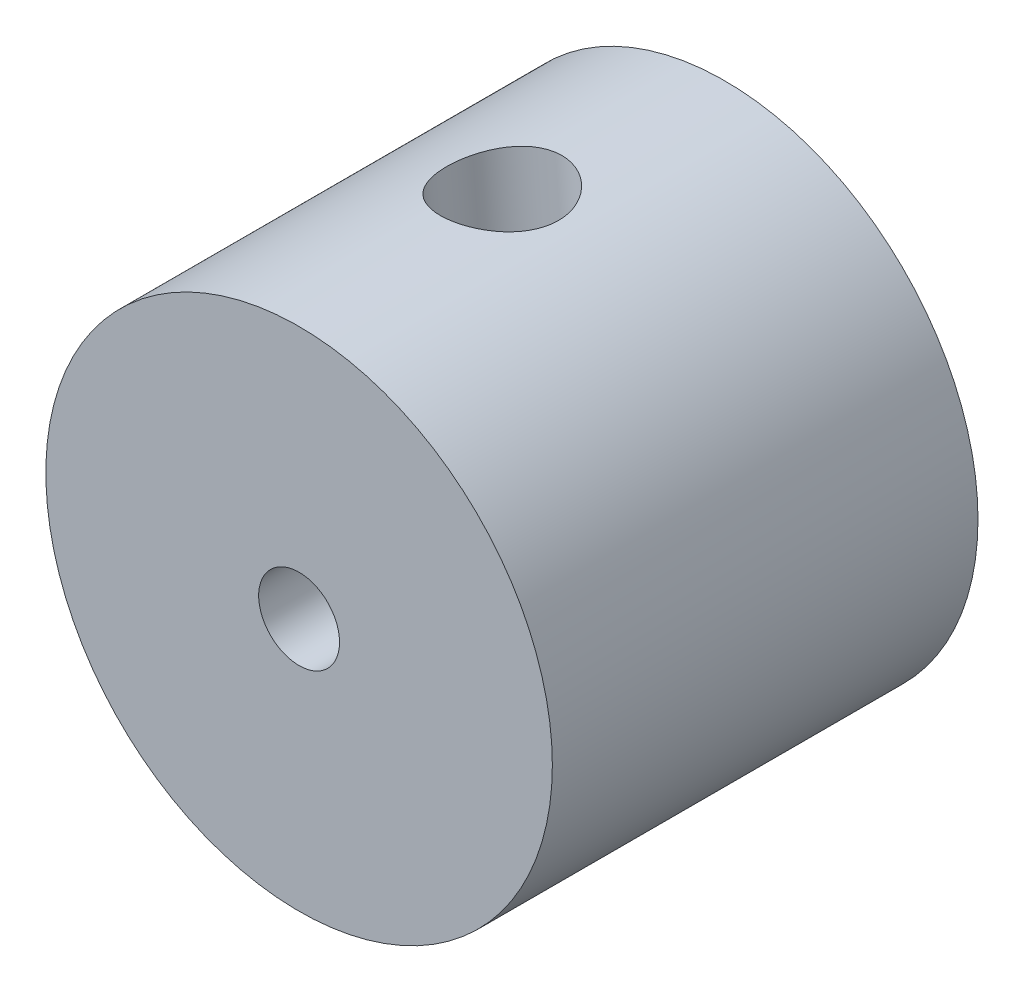
ISO-10303-21;
HEADER;
FILE_DESCRIPTION(('STEP AP214'),'2;1');
FILE_NAME('part.step','',(''),(''),'','','');
FILE_SCHEMA(('AUTOMOTIVE_DESIGN { 1 0 10303 214 1 1 1 1 }'));
ENDSEC;
DATA;
#1=APPLICATION_CONTEXT('core data for automotive mechanical design processes');
#2=APPLICATION_PROTOCOL_DEFINITION('international standard','automotive_design',2000,#1);
#3=PRODUCT_CONTEXT('',#1,'mechanical');
#4=PRODUCT('Part','Part','',(#3));
#5=PRODUCT_RELATED_PRODUCT_CATEGORY('part','',(#4));
#6=PRODUCT_DEFINITION_FORMATION('','',#4);
#7=PRODUCT_DEFINITION_CONTEXT('part definition',#1,'design');
#8=PRODUCT_DEFINITION('design','',#6,#7);
#9=PRODUCT_DEFINITION_SHAPE('','',#8);
#10=(LENGTH_UNIT() NAMED_UNIT(*) SI_UNIT(.MILLI.,.METRE.));
#11=(NAMED_UNIT(*) PLANE_ANGLE_UNIT() SI_UNIT($,.RADIAN.));
#12=(NAMED_UNIT(*) SI_UNIT($,.STERADIAN.) SOLID_ANGLE_UNIT());
#13=UNCERTAINTY_MEASURE_WITH_UNIT(LENGTH_MEASURE(1.E-05),#10,'distance_accuracy_value','');
#14=(GEOMETRIC_REPRESENTATION_CONTEXT(3) GLOBAL_UNCERTAINTY_ASSIGNED_CONTEXT((#13)) GLOBAL_UNIT_ASSIGNED_CONTEXT((#10,
#11,#12)) REPRESENTATION_CONTEXT('',''));
#15=CARTESIAN_POINT('',(0.,0.,0.));
#16=DIRECTION('',(0.,0.,1.));
#17=DIRECTION('',(1.,0.,0.));
#18=AXIS2_PLACEMENT_3D('',#15,#16,#17);
#19=CARTESIAN_POINT('',(-101.724686529122,42.0830003924011,0.));
#20=DIRECTION('',(0.,0.,1.));
#21=DIRECTION('',(1.,0.,0.));
#22=AXIS2_PLACEMENT_3D('',#19,#20,#21);
#23=CYLINDRICAL_SURFACE('',#22,0.950000000000001);
#24=CARTESIAN_POINT('',(-100.774686529122,42.0830003924011,3.81582903150164));
#25=CARTESIAN_POINT('',(-100.774690590628,42.1251501131702,3.81943106784858));
#26=CARTESIAN_POINT('',(-100.777521148495,42.1676200712224,3.82018587258182));
#27=CARTESIAN_POINT('',(-100.788791079742,42.2515248182766,3.81581107943095));
#28=CARTESIAN_POINT('',(-100.797240846311,42.292957541203,3.81067056487929));
#29=CARTESIAN_POINT('',(-100.81911578574,42.3730941051948,3.79554787094767));
#30=CARTESIAN_POINT('',(-100.832495480309,42.4118191560255,3.78560969756203));
#31=CARTESIAN_POINT('',(-100.863621404896,42.4863652127129,3.76231851410442));
#32=CARTESIAN_POINT('',(-100.881372579375,42.5221828686734,3.74896163655258));
#33=CARTESIAN_POINT('',(-100.929437269046,42.6058031634875,3.71383825704178));
#34=CARTESIAN_POINT('',(-100.961840465672,42.6519377470104,3.69095863685849));
#35=CARTESIAN_POINT('',(-101.033889734659,42.7375508612524,3.6440690273598));
#36=CARTESIAN_POINT('',(-101.073547970446,42.777017996663,3.62005719077712));
#37=CARTESIAN_POINT('',(-101.160157211153,42.8491718166784,3.57309553464666));
#38=CARTESIAN_POINT('',(-101.207189180456,42.8817724724107,3.55016170107719));
#39=CARTESIAN_POINT('',(-101.307565422596,42.9384617933731,3.50798985843216));
#40=CARTESIAN_POINT('',(-101.360894802986,42.9625700242422,3.48874340136334));
#41=CARTESIAN_POINT('',(-101.458850936468,42.9961330137317,3.46011477162454));
#42=CARTESIAN_POINT('',(-101.502374313667,43.0077362602125,3.44947034091687));
#43=CARTESIAN_POINT('',(-101.591413173935,43.0246939790753,3.43229909590482));
#44=CARTESIAN_POINT('',(-101.636927208369,43.0300529195523,3.42576933889595));
#45=CARTESIAN_POINT('',(-101.728864278198,43.0341085918336,3.41738606206748));
#46=CARTESIAN_POINT('',(-101.775290063706,43.0327804840429,3.4155500155358));
#47=CARTESIAN_POINT('',(-101.867385453225,43.0233616075015,3.41678192200015));
#48=CARTESIAN_POINT('',(-101.91305503913,43.0152706770671,3.41984999224405));
#49=CARTESIAN_POINT('',(-101.999598781118,42.9933851932887,3.4302806553691));
#50=CARTESIAN_POINT('',(-102.040597295999,42.9799505213036,3.43738254756209));
#51=CARTESIAN_POINT('',(-102.119740564586,42.9480176441543,3.45512231417378));
#52=CARTESIAN_POINT('',(-102.157884741451,42.9295184189801,3.46576090098172));
#53=CARTESIAN_POINT('',(-102.233639074681,42.8864409982862,3.49083233766431));
#54=CARTESIAN_POINT('',(-102.270959149442,42.8614933674629,3.50550165668136));
#55=CARTESIAN_POINT('',(-102.341141193315,42.8071934342843,3.53715417263129));
#56=CARTESIAN_POINT('',(-102.374000179885,42.7778382124995,3.55413890251718));
#57=CARTESIAN_POINT('',(-102.440525660233,42.7096844280217,3.59257595975505));
#58=CARTESIAN_POINT('',(-102.47327753289,42.67013670248,3.61428284336614));
#59=CARTESIAN_POINT('',(-102.532044929159,42.5862866870009,3.6577414155167));
#60=CARTESIAN_POINT('',(-102.558055140557,42.541980686337,3.67949312585803));
#61=CARTESIAN_POINT('',(-102.600301935685,42.4543268003086,3.71849703562786));
#62=CARTESIAN_POINT('',(-102.617320692432,42.4114600498636,3.73597871306606));
#63=CARTESIAN_POINT('',(-102.645166141163,42.3225358695937,3.76737291899756));
#64=CARTESIAN_POINT('',(-102.656005604297,42.2764852427362,3.78129277585908));
#65=CARTESIAN_POINT('',(-102.669184866277,42.1918579396648,3.80101942494764));
#66=CARTESIAN_POINT('',(-102.67283272023,42.1537460184548,3.8079167524934));
#67=CARTESIAN_POINT('',(-102.675442726081,42.076828232475,3.8171101195307));
#68=CARTESIAN_POINT('',(-102.674411322462,42.0380233953919,3.8194124811218));
#69=CARTESIAN_POINT('',(-102.667593308135,41.9608076128348,3.81903916359331));
#70=CARTESIAN_POINT('',(-102.661800422861,41.922397254858,3.81635690998237));
#71=CARTESIAN_POINT('',(-102.645741509669,41.8471083232737,3.80645165092301));
#72=CARTESIAN_POINT('',(-102.63546858025,41.8102322095614,3.79922163201662));
#73=CARTESIAN_POINT('',(-102.607237462359,41.7280052308241,3.77851670298021));
#74=CARTESIAN_POINT('',(-102.587896686496,41.6834450464489,3.76381704923519));
#75=CARTESIAN_POINT('',(-102.543417399202,41.5987715964862,3.73086654423297));
#76=CARTESIAN_POINT('',(-102.518269375775,41.5586657883384,3.7126098745045));
#77=CARTESIAN_POINT('',(-102.462008584022,41.4820209229661,3.67403726558315));
#78=CARTESIAN_POINT('',(-102.430750223304,41.445611013457,3.65367836968827));
#79=CARTESIAN_POINT('',(-102.363092722419,41.3778545866823,3.61304209849248));
#80=CARTESIAN_POINT('',(-102.326691233478,41.3465103969403,3.59276476481531));
#81=CARTESIAN_POINT('',(-102.2410141036,41.2834464504577,3.54973204293052));
#82=CARTESIAN_POINT('',(-102.190629817492,41.2529716811784,3.52732302610619));
#83=CARTESIAN_POINT('',(-102.08357891009,41.2014081794574,3.48718048918752));
#84=CARTESIAN_POINT('',(-102.026924189407,41.1803020354328,3.46943832098459));
#85=CARTESIAN_POINT('',(-101.925603326723,41.153452664373,3.44486171584237));
#86=CARTESIAN_POINT('',(-101.882036221604,41.1450600253032,3.43636341571306));
#87=CARTESIAN_POINT('',(-101.793556137511,41.1344559764775,3.42359076740122));
#88=CARTESIAN_POINT('',(-101.748644372919,41.1322391498837,3.4193127197419));
#89=CARTESIAN_POINT('',(-101.658650733092,41.134227624368,3.41534839472862));
#90=CARTESIAN_POINT('',(-101.613568704282,41.1384477249191,3.41567271315909));
#91=CARTESIAN_POINT('',(-101.524719159249,41.1531929018288,3.42090843845497));
#92=CARTESIAN_POINT('',(-101.480951988115,41.1637196184622,3.42582103886304));
#93=CARTESIAN_POINT('',(-101.397204755754,41.1901792156551,3.43959766112659));
#94=CARTESIAN_POINT('',(-101.357151443098,41.2059453318082,3.44834216283184));
#95=CARTESIAN_POINT('',(-101.280231248486,41.2423035368944,3.4691019258181));
#96=CARTESIAN_POINT('',(-101.243365015247,41.2628966051823,3.481117850928));
#97=CARTESIAN_POINT('',(-101.169478021901,41.3107391107951,3.50911153398412));
#98=CARTESIAN_POINT('',(-101.132880653913,41.3384700361484,3.52537874844605));
#99=CARTESIAN_POINT('',(-101.064537373007,41.3983321602146,3.55991217883494));
#100=CARTESIAN_POINT('',(-101.032796042788,41.4304674618393,3.57818025544673));
#101=CARTESIAN_POINT('',(-100.968925690006,41.5049333776663,3.61905795570863));
#102=CARTESIAN_POINT('',(-100.937822233647,41.5480486357805,3.64184320057471));
#103=CARTESIAN_POINT('',(-100.883021196804,41.6392329597678,3.68653889010686));
#104=CARTESIAN_POINT('',(-100.859326845356,41.6873041734432,3.70844894973143));
#105=CARTESIAN_POINT('',(-100.824179605961,41.7773793147618,3.74443385963577));
#106=CARTESIAN_POINT('',(-100.811197239429,41.818514138024,3.75918556905784));
#107=CARTESIAN_POINT('',(-100.790839924944,41.9032454918959,3.78474563784491));
#108=CARTESIAN_POINT('',(-100.783442387884,41.9468313311289,3.79556978975154));
#109=CARTESIAN_POINT('',(-100.777662095367,42.0063353084922,3.80630430916893));
#110=CARTESIAN_POINT('',(-100.776550755503,42.021576412203,3.8087082121724));
#111=CARTESIAN_POINT('',(-100.775061991886,42.0521974604746,3.81281179516606));
#112=CARTESIAN_POINT('',(-100.774685042986,42.0675774884114,3.81451101895653));
#113=CARTESIAN_POINT('',(-100.774686529122,42.0830003924011,3.81582903150164));
#114=B_SPLINE_CURVE_WITH_KNOTS('',3,(#24,#25,#26,#27,#28,#29,#30,#31,#32,#33,#34,#35,#36,#37,
#38,#39,#40,#41,#42,#43,#44,#45,#46,#47,#48,#49,#50,#51,#52,#53,#54,#55,#56,#57,#58,#59,#60,#61,
#62,#63,#64,#65,#66,#67,#68,#69,#70,#71,#72,#73,#74,#75,#76,#77,#78,#79,#80,#81,#82,#83,#84,#85,
#86,#87,#88,#89,#90,#91,#92,#93,#94,#95,#96,#97,#98,#99,#100,#101,#102,#103,#104,#105,#106,#107,
#108,#109,#110,#111,#112,#113),.UNSPECIFIED.,.T.,.F.,(4,2,2,2,2,2,2,2,2,2,2,2,2,2,2,2,2,2,2,2,2,
2,2,2,2,2,2,2,2,2,2,2,2,2,2,2,2,2,2,2,2,2,2,2,4),(0.,0.126834565959049,0.253904377794771,
0.379830184581281,0.505899082083183,0.687484404541212,0.869377001090433,1.05342828858443,
1.23705272479122,1.37532866363979,1.51350559866682,1.65219618118802,1.79089007958035,
1.92150104577205,2.05213833662383,2.19329015130322,2.33453587570216,2.50114605226263,
2.66788711594665,2.81535621692178,2.96251941846731,3.07873558868345,3.19479174941807,
3.31100109185025,3.42739009050359,3.57881699415329,3.73049370961898,3.88636075269602,
4.04229920894432,4.23026422906981,4.41787843856166,4.55282683637982,4.68765683292341,
4.82279729170881,4.95797291416565,5.08920300429009,5.22045974316217,5.36606051561412,
5.51179785671386,5.68463664998522,5.85755066520237,5.99386911550267,6.12963319655031,
6.17601295172733,6.22242268582923),.UNSPECIFIED.);
#115=CARTESIAN_POINT('',(-100.774686529122,42.0830003924011,3.81582903150164));
#116=VERTEX_POINT('',#115);
#117=EDGE_CURVE('E43',#116,#116,#114,.T.);
#118=ORIENTED_EDGE('',*,*,#117,.T.);
#119=EDGE_LOOP('',(#118));
#120=FACE_BOUND('',#119,.T.);
#121=CARTESIAN_POINT('',(-101.724686529122,42.0830003924011,0.));
#122=DIRECTION('',(0.,0.,1.));
#123=DIRECTION('',(1.,0.,0.));
#124=AXIS2_PLACEMENT_3D('',#121,#122,#123);
#125=CIRCLE('',#124,0.950000000000001);
#126=CARTESIAN_POINT('',(-100.774686529122,42.0830003924011,0.));
#127=VERTEX_POINT('',#126);
#128=EDGE_CURVE('E57',#127,#127,#125,.T.);
#129=ORIENTED_EDGE('',*,*,#128,.F.);
#130=EDGE_LOOP('',(#129));
#131=FACE_BOUND('',#130,.T.);
#132=ADVANCED_FACE('F38',(#120,#131),#23,.F.);
#133=CARTESIAN_POINT('',(-101.724686529122,42.0830003924011,10.));
#134=DIRECTION('',(0.,0.,-1.));
#135=DIRECTION('',(-1.,0.,0.));
#136=AXIS2_PLACEMENT_3D('',#133,#134,#135);
#137=CYLINDRICAL_SURFACE('',#136,5.94999999999999);
#138=CARTESIAN_POINT('',(-100.891860913017,47.9744264925198,4.73684906850577));
#139=CARTESIAN_POINT('',(-100.891863507369,47.9744277595857,4.81005151140747));
#140=CARTESIAN_POINT('',(-100.898062704026,47.9753134150958,4.88328351213676));
#141=CARTESIAN_POINT('',(-100.922657484656,47.9787105212977,5.02766292968108));
#142=CARTESIAN_POINT('',(-100.941061715574,47.9812231246093,5.09880883120675));
#143=CARTESIAN_POINT('',(-100.989428044573,47.9874465760178,5.2369066915101));
#144=CARTESIAN_POINT('',(-101.019377242851,47.9911560859962,5.30386323456962));
#145=CARTESIAN_POINT('',(-101.08990303656,47.9991481178258,5.43187284663784));
#146=CARTESIAN_POINT('',(-101.130479480326,48.0034306314991,5.49292599987778));
#147=CARTESIAN_POINT('',(-101.221807264878,48.0118908912762,5.60845848932115));
#148=CARTESIAN_POINT('',(-101.272707716022,48.0160659539416,5.66282017174686));
#149=CARTESIAN_POINT('',(-101.382852459327,48.0234288872868,5.76239557507941));
#150=CARTESIAN_POINT('',(-101.442097411589,48.0266166798037,5.80760857157966));
#151=CARTESIAN_POINT('',(-101.567989080201,48.0312732584628,5.888070144961));
#152=CARTESIAN_POINT('',(-101.634709111451,48.0327230238927,5.92320532069234));
#153=CARTESIAN_POINT('',(-101.773108986964,48.0332052055668,5.98177986887472));
#154=CARTESIAN_POINT('',(-101.84478825658,48.0322379014324,6.00522059383443));
#155=CARTESIAN_POINT('',(-101.989811564912,48.0275260302917,6.03937013143669));
#156=CARTESIAN_POINT('',(-102.063110125938,48.0238264950248,6.05027813782658));
#157=CARTESIAN_POINT('',(-102.210300557901,48.0136089963447,6.05967563808762));
#158=CARTESIAN_POINT('',(-102.284192357987,48.0070913647197,6.05816659350172));
#159=CARTESIAN_POINT('',(-102.429107515623,47.9915967958284,6.04292068411239));
#160=CARTESIAN_POINT('',(-102.500158448069,47.9826649548474,6.0293985534952));
#161=CARTESIAN_POINT('',(-102.638769313416,47.9627842425787,5.99085279225514));
#162=CARTESIAN_POINT('',(-102.706329085239,47.9518352783298,5.96582863147107));
#163=CARTESIAN_POINT('',(-102.836661551408,47.9285483646309,5.90480082946176));
#164=CARTESIAN_POINT('',(-102.899394562374,47.9162006178814,5.86871628619455));
#165=CARTESIAN_POINT('',(-103.017921317921,47.8910740761539,5.78665244938836));
#166=CARTESIAN_POINT('',(-103.07371408905,47.8782952210266,5.74067177025954));
#167=CARTESIAN_POINT('',(-103.178087575063,47.8530155646079,5.6389535257928));
#168=CARTESIAN_POINT('',(-103.226488176351,47.8405265851903,5.58302803811449));
#169=CARTESIAN_POINT('',(-103.313346108912,47.8171690009473,5.46362063059234));
#170=CARTESIAN_POINT('',(-103.351803154041,47.806300442756,5.40013849337011));
#171=CARTESIAN_POINT('',(-103.417818783722,47.7871211982992,5.26712198293465));
#172=CARTESIAN_POINT('',(-103.445342909704,47.7788186174912,5.19756930356998));
#173=CARTESIAN_POINT('',(-103.488490299563,47.7656063758217,5.05456127430185));
#174=CARTESIAN_POINT('',(-103.504115514105,47.7606961588402,4.98110656619663));
#175=CARTESIAN_POINT('',(-103.522772751964,47.7548149651632,4.83403107376751));
#176=CARTESIAN_POINT('',(-103.526062143235,47.7537634918544,4.76044611657111));
#177=CARTESIAN_POINT('',(-103.520657447249,47.7554774802773,4.61376654507161));
#178=CARTESIAN_POINT('',(-103.511964209955,47.7582426712818,4.54067189635904));
#179=CARTESIAN_POINT('',(-103.483049926903,47.7672664426797,4.39797011910004));
#180=CARTESIAN_POINT('',(-103.462971532851,47.7734817742089,4.32833121819974));
#181=CARTESIAN_POINT('',(-103.411980420845,47.7888082854767,4.19348118176271));
#182=CARTESIAN_POINT('',(-103.381066640398,47.7979197491949,4.12827048119336));
#183=CARTESIAN_POINT('',(-103.308672374323,47.8184097929111,4.00299135541879));
#184=CARTESIAN_POINT('',(-103.267032477575,47.8298219547725,3.94302058845529));
#185=CARTESIAN_POINT('',(-103.174518155789,47.8538553908339,3.83095648707496));
#186=CARTESIAN_POINT('',(-103.12364254782,47.8664768198217,3.77886416331527));
#187=CARTESIAN_POINT('',(-103.012870124571,47.8921630789615,3.68300976973398));
#188=CARTESIAN_POINT('',(-102.952818481304,47.9052317674231,3.6394273934543));
#189=CARTESIAN_POINT('',(-102.826014004396,47.9305427417425,3.56311700268554));
#190=CARTESIAN_POINT('',(-102.759261488792,47.9427850667752,3.53038847336768));
#191=CARTESIAN_POINT('',(-102.621325853411,47.9654647214771,3.47696289364082));
#192=CARTESIAN_POINT('',(-102.550174656856,47.9759133607018,3.45618835608036));
#193=CARTESIAN_POINT('',(-102.405081249218,47.9944220877165,3.42701925166209));
#194=CARTESIAN_POINT('',(-102.33113945842,48.0024825335823,3.41862282813015));
#195=CARTESIAN_POINT('',(-102.18424775916,48.0156748594954,3.41453386540404));
#196=CARTESIAN_POINT('',(-102.111310477556,48.0208657084977,3.41857336082946));
#197=CARTESIAN_POINT('',(-101.966961448507,48.0285052301886,3.43864077439696));
#198=CARTESIAN_POINT('',(-101.895549672051,48.0309539550723,3.45466846433869));
#199=CARTESIAN_POINT('',(-101.75651752768,48.0333204486196,3.49812727165742));
#200=CARTESIAN_POINT('',(-101.688885067609,48.0332468146795,3.5255193384525));
#201=CARTESIAN_POINT('',(-101.558985270854,48.0310478249719,3.59089165905028));
#202=CARTESIAN_POINT('',(-101.49671847246,48.0289222636123,3.62887297356808));
#203=CARTESIAN_POINT('',(-101.378052653551,48.0231979093007,3.71521384967846));
#204=CARTESIAN_POINT('',(-101.321791619772,48.0195712153298,3.76376122469022));
#205=CARTESIAN_POINT('',(-101.218088967807,48.0116233499814,3.86947866866491));
#206=CARTESIAN_POINT('',(-101.170649487357,48.0073020107417,3.92665082161358));
#207=CARTESIAN_POINT('',(-101.085358489857,47.9987106099988,4.04894837909917));
#208=CARTESIAN_POINT('',(-101.047649023648,47.9944420900945,4.1141730613194));
#209=CARTESIAN_POINT('',(-100.983893664957,47.9867928043609,4.25010321235868));
#210=CARTESIAN_POINT('',(-100.957838033622,47.9834112982548,4.320804046687));
#211=CARTESIAN_POINT('',(-100.922749379218,47.9787301798768,4.44910767292731));
#212=CARTESIAN_POINT('',(-100.911189726945,47.9771316852269,4.50602169077069));
#213=CARTESIAN_POINT('',(-100.895744664758,47.9749793667366,4.62090068320236));
#214=CARTESIAN_POINT('',(-100.891858858038,47.9744254888801,4.67886560329306));
#215=CARTESIAN_POINT('',(-100.891860913017,47.9744264925198,4.73684906850577));
#216=B_SPLINE_CURVE_WITH_KNOTS('',3,(#138,#139,#140,#141,#142,#143,#144,#145,#146,#147,#148,
#149,#150,#151,#152,#153,#154,#155,#156,#157,#158,#159,#160,#161,#162,#163,#164,#165,#166,#167,
#168,#169,#170,#171,#172,#173,#174,#175,#176,#177,#178,#179,#180,#181,#182,#183,#184,#185,#186,
#187,#188,#189,#190,#191,#192,#193,#194,#195,#196,#197,#198,#199,#200,#201,#202,#203,#204,#205,
#206,#207,#208,#209,#210,#211,#212,#213,#214,#215),.UNSPECIFIED.,.T.,.F.,(4,2,2,2,2,2,2,2,2,2,2,
2,2,2,2,2,2,2,2,2,2,2,2,2,2,2,2,2,2,2,2,2,2,2,2,2,2,2,4),(0.,0.219394784034832,
0.438945169801869,0.658250948071477,0.877553596762394,1.10028368527723,1.32303140299739,
1.54819521323751,1.77333297636787,1.99484064467528,2.21632224090309,2.43392276584724,
2.65153332162294,2.87077520852378,3.09004781218004,3.31401798199586,3.53799459620843,
3.76267164652474,3.98731185612467,4.20723835381596,4.42714925228129,4.64436377876166,
4.86159961073103,5.08227172183465,5.30297211708223,5.52792169299673,5.75286059738761,
5.97632450210484,6.19975488460054,6.41840480746617,6.63705056834412,6.8549511550666,
7.07287357653526,7.29504254601674,7.51726528392696,7.74256901876856,7.96768411884508,
8.14147514520605,8.31525718476195),.UNSPECIFIED.);
#217=CARTESIAN_POINT('',(-100.891860913017,47.9744264925198,4.73684906850577));
#218=VERTEX_POINT('',#217);
#219=EDGE_CURVE('E84',#218,#218,#216,.T.);
#220=ORIENTED_EDGE('',*,*,#219,.T.);
#221=EDGE_LOOP('',(#220));
#222=FACE_BOUND('',#221,.T.);
#223=CARTESIAN_POINT('',(-99.9250972738682,36.4116708734634,4.73684906850577));
#224=CARTESIAN_POINT('',(-99.9250996217906,36.4116691931733,4.66364662560406));
#225=CARTESIAN_POINT('',(-99.9310656758017,36.4097663993274,4.59041462487478));
#226=CARTESIAN_POINT('',(-99.9547548548228,36.4023322644031,4.44603520733046));
#227=CARTESIAN_POINT('',(-99.9724863153191,36.3967983508012,4.37488930580478));
#228=CARTESIAN_POINT('',(-100.019147651304,36.3826296228301,4.23679144550143));
#229=CARTESIAN_POINT('',(-100.048065028302,36.3739982701341,4.16983490244191));
#230=CARTESIAN_POINT('',(-100.116284471974,36.3544057293062,4.04182529037369));
#231=CARTESIAN_POINT('',(-100.155586390448,36.3434445744237,3.98077213713376));
#232=CARTESIAN_POINT('',(-100.244241251226,36.3199359401142,3.86523964769039));
#233=CARTESIAN_POINT('',(-100.293741679213,36.3073663456884,3.81087796526468));
#234=CARTESIAN_POINT('',(-100.401134460744,36.2818150690026,3.71130256193212));
#235=CARTESIAN_POINT('',(-100.459027478203,36.2688333542044,3.66608956543188));
#236=CARTESIAN_POINT('',(-100.582397966456,36.2433359312163,3.58562799205054));
#237=CARTESIAN_POINT('',(-100.647950892794,36.2308268050205,3.5504928163192));
#238=CARTESIAN_POINT('',(-100.784349118797,36.2073687150589,3.49191826813682));
#239=CARTESIAN_POINT('',(-100.855193805358,36.1964195709799,3.4684775431771));
#240=CARTESIAN_POINT('',(-100.998986024167,36.1769835348864,3.43432800557485));
#241=CARTESIAN_POINT('',(-101.071881232206,36.1684597883631,3.42341999918495));
#242=CARTESIAN_POINT('',(-101.21872474707,36.154093066998,3.41402249892392));
#243=CARTESIAN_POINT('',(-101.292672928933,36.1482497767398,3.41553154350982));
#244=CARTESIAN_POINT('',(-101.438149067171,36.1394646881494,3.43077745289915));
#245=CARTESIAN_POINT('',(-101.50969672692,36.1364738405887,3.44429958351633));
#246=CARTESIAN_POINT('',(-101.649684463672,36.1330608841767,3.48284534475639));
#247=CARTESIAN_POINT('',(-101.718124397271,36.1326388937441,3.50786950554047));
#248=CARTESIAN_POINT('',(-101.850514306056,36.1339595523682,3.56889730754978));
#249=CARTESIAN_POINT('',(-101.91442677577,36.1357184524953,3.60498185081699));
#250=CARTESIAN_POINT('',(-102.035480374954,36.1408136467447,3.68704568762318));
#251=CARTESIAN_POINT('',(-102.092620554475,36.1441501618324,3.73302636675199));
#252=CARTESIAN_POINT('',(-102.199742817817,36.1517466286165,3.83474461121874));
#253=CARTESIAN_POINT('',(-102.249545325651,36.1560248321361,3.89067009889705));
#254=CARTESIAN_POINT('',(-102.339076047703,36.1646345359208,4.01007750641919));
#255=CARTESIAN_POINT('',(-102.378803972007,36.168966037716,4.07355964364143));
#256=CARTESIAN_POINT('',(-102.447087918277,36.1769164755578,4.20657615407689));
#257=CARTESIAN_POINT('',(-102.475608614118,36.1805331408552,4.27612883344156));
#258=CARTESIAN_POINT('',(-102.520350951942,36.1863969099134,4.41913686270969));
#259=CARTESIAN_POINT('',(-102.536574609856,36.1886442381464,4.49259157081491));
#260=CARTESIAN_POINT('',(-102.555949433539,36.1913455657576,4.63966706324403));
#261=CARTESIAN_POINT('',(-102.559367761121,36.1918362057406,4.71325202044043));
#262=CARTESIAN_POINT('',(-102.553753481371,36.1910435154437,4.85993159193993));
#263=CARTESIAN_POINT('',(-102.544721757157,36.1897603109877,4.9330262406525));
#264=CARTESIAN_POINT('',(-102.514710445046,36.1856633169684,5.0757280179115));
#265=CARTESIAN_POINT('',(-102.493878710123,36.1828684871318,5.14536691881179));
#266=CARTESIAN_POINT('',(-102.441050459981,36.176222327475,5.28021695524883));
#267=CARTESIAN_POINT('',(-102.409052849864,36.1723708940548,5.34542765581818));
#268=CARTESIAN_POINT('',(-102.334261159228,36.1641870890787,5.47070678159274));
#269=CARTESIAN_POINT('',(-102.291304304309,36.1598480736364,5.53067754855624));
#270=CARTESIAN_POINT('',(-102.196083496203,36.1515111984425,5.64274164993657));
#271=CARTESIAN_POINT('',(-102.143818350805,36.1475133824891,5.69483397369626));
#272=CARTESIAN_POINT('',(-102.030318474469,36.1405785621629,5.79068836727756));
#273=CARTESIAN_POINT('',(-101.968930424508,36.1376634636958,5.83427074355724));
#274=CARTESIAN_POINT('',(-101.83968340716,36.1337609911688,5.910581134326));
#275=CARTESIAN_POINT('',(-101.771824746891,36.1327735256649,5.94330966364385));
#276=CARTESIAN_POINT('',(-101.632038074285,36.1333142725685,5.99673524337071));
#277=CARTESIAN_POINT('',(-101.560139663883,36.1348260312937,6.01750978093117));
#278=CARTESIAN_POINT('',(-101.413987221163,36.1406684111826,6.04667888534945));
#279=CARTESIAN_POINT('',(-101.339733543834,36.1449986094497,6.05507530888139));
#280=CARTESIAN_POINT('',(-101.192690615908,36.1563821994525,6.0591642716075));
#281=CARTESIAN_POINT('',(-101.119904024504,36.1633753441643,6.05512477618208));
#282=CARTESIAN_POINT('',(-100.976290559163,36.1798124075183,6.03505736261458));
#283=CARTESIAN_POINT('',(-100.905463647949,36.1892562795077,6.01902967267284));
#284=CARTESIAN_POINT('',(-100.767968882314,36.2100102401711,5.97557086535411));
#285=CARTESIAN_POINT('',(-100.70128767595,36.2213138588335,5.94817879855903));
#286=CARTESIAN_POINT('',(-100.573556603618,36.2450534020874,5.88280647796125));
#287=CARTESIAN_POINT('',(-100.512507302609,36.2574894400283,5.84482516344346));
#288=CARTESIAN_POINT('',(-100.396439652749,36.2828398929944,5.75848428733307));
#289=CARTESIAN_POINT('',(-100.341562008018,36.2957589076565,5.70993691232131));
#290=CARTESIAN_POINT('',(-100.24061900768,36.3208172250523,5.60421946834663));
#291=CARTESIAN_POINT('',(-100.194555788001,36.3329563383266,5.54704731539796));
#292=CARTESIAN_POINT('',(-100.111875675197,36.3555918274529,5.42474975791237));
#293=CARTESIAN_POINT('',(-100.075398604646,36.3660630942297,5.35952507569215));
#294=CARTESIAN_POINT('',(-100.013798677351,36.3841933532243,5.22359492465285));
#295=CARTESIAN_POINT('',(-99.9886663398998,36.3918546926689,5.15289409032453));
#296=CARTESIAN_POINT('',(-99.9548422090054,36.4022976188109,5.02459046408422));
#297=CARTESIAN_POINT('',(-99.9437084989473,36.4057935087077,4.96767644624085));
#298=CARTESIAN_POINT('',(-99.9288352926511,36.4104807419308,4.85279745380918));
#299=CARTESIAN_POINT('',(-99.925095414085,36.4116722044169,4.79483253371847));
#300=CARTESIAN_POINT('',(-99.9250972738682,36.4116708734634,4.73684906850577));
#301=B_SPLINE_CURVE_WITH_KNOTS('',3,(#223,#224,#225,#226,#227,#228,#229,#230,#231,#232,#233,
#234,#235,#236,#237,#238,#239,#240,#241,#242,#243,#244,#245,#246,#247,#248,#249,#250,#251,#252,
#253,#254,#255,#256,#257,#258,#259,#260,#261,#262,#263,#264,#265,#266,#267,#268,#269,#270,#271,
#272,#273,#274,#275,#276,#277,#278,#279,#280,#281,#282,#283,#284,#285,#286,#287,#288,#289,#290,
#291,#292,#293,#294,#295,#296,#297,#298,#299,#300),.UNSPECIFIED.,.T.,.F.,(4,2,2,2,2,2,2,2,2,2,2,
2,2,2,2,2,2,2,2,2,2,2,2,2,2,2,2,2,2,2,2,2,2,2,2,2,2,2,4),(0.,0.21939478403483,0.438945169801867,
0.658250948071481,0.877553596762394,1.10028368527722,1.32303140299739,1.54819521323751,
1.77333297636787,1.99484064467525,2.21632224090308,2.43392276584725,2.65153332162295,
2.87077520852379,3.09004781218005,3.31401798199585,3.53799459620842,3.76267164652475,
3.98731185612467,4.20723835381596,4.4271492522813,4.64436377876166,4.86159961073103,
5.08227172183465,5.30297211708224,5.52792169299674,5.75286059738762,5.97632450210484,
6.19975488460054,6.41840480746617,6.63705056834415,6.85495115506662,7.07287357653527,
7.29504254601675,7.51726528392697,7.74256901876857,7.96768411884509,8.14147514520606,
8.31525718476195),.UNSPECIFIED.);
#302=CARTESIAN_POINT('',(-99.9250972738682,36.4116708734634,4.73684906850577));
#303=VERTEX_POINT('',#302);
#304=EDGE_CURVE('E67',#303,#303,#301,.T.);
#305=ORIENTED_EDGE('',*,*,#304,.T.);
#306=EDGE_LOOP('',(#305));
#307=FACE_BOUND('',#306,.T.);
#308=CARTESIAN_POINT('',(-101.724686529122,42.0830003924011,10.));
#309=DIRECTION('',(0.,0.,1.));
#310=DIRECTION('',(1.,0.,0.));
#311=AXIS2_PLACEMENT_3D('',#308,#309,#310);
#312=CIRCLE('',#311,5.94999999999999);
#313=CARTESIAN_POINT('',(-95.7746865291223,42.0830003924011,10.));
#314=VERTEX_POINT('',#313);
#315=EDGE_CURVE('E10',#314,#314,#312,.T.);
#316=ORIENTED_EDGE('',*,*,#315,.F.);
#317=EDGE_LOOP('',(#316));
#318=FACE_BOUND('',#317,.T.);
#319=CARTESIAN_POINT('',(-101.724686529122,42.0830003924011,0.));
#320=DIRECTION('',(0.,0.,1.));
#321=DIRECTION('',(1.,0.,0.));
#322=AXIS2_PLACEMENT_3D('',#319,#320,#321);
#323=CIRCLE('',#322,5.94999999999999);
#324=CARTESIAN_POINT('',(-95.7746865291223,42.0830003924011,0.));
#325=VERTEX_POINT('',#324);
#326=EDGE_CURVE('E52',#325,#325,#323,.T.);
#327=ORIENTED_EDGE('',*,*,#326,.T.);
#328=EDGE_LOOP('',(#327));
#329=FACE_BOUND('',#328,.T.);
#330=ADVANCED_FACE('F40',(#222,#307,#318,#329),#137,.T.);
#331=CARTESIAN_POINT('',(-101.724686529122,42.0830003924011,10.));
#332=DIRECTION('',(0.,0.,1.));
#333=DIRECTION('',(1.,0.,0.));
#334=AXIS2_PLACEMENT_3D('',#331,#332,#333);
#335=PLANE('',#334);
#336=CARTESIAN_POINT('',(-101.724686529122,42.0830003924011,10.));
#337=DIRECTION('',(0.,0.,1.));
#338=DIRECTION('',(1.,0.,0.));
#339=AXIS2_PLACEMENT_3D('',#336,#337,#338);
#340=CIRCLE('',#339,0.950000000000001);
#341=CARTESIAN_POINT('',(-100.774686529122,42.0830003924011,10.));
#342=VERTEX_POINT('',#341);
#343=EDGE_CURVE('E60',#342,#342,#340,.T.);
#344=ORIENTED_EDGE('',*,*,#343,.F.);
#345=EDGE_LOOP('',(#344));
#346=FACE_BOUND('',#345,.T.);
#347=ORIENTED_EDGE('',*,*,#315,.T.);
#348=EDGE_LOOP('',(#347));
#349=FACE_BOUND('',#348,.T.);
#350=ADVANCED_FACE('F96',(#346,#349),#335,.T.);
#351=CARTESIAN_POINT('',(-101.724686529122,42.0830003924011,0.));
#352=DIRECTION('',(0.,0.,1.));
#353=DIRECTION('',(1.,0.,0.));
#354=AXIS2_PLACEMENT_3D('',#351,#352,#353);
#355=PLANE('',#354);
#356=ORIENTED_EDGE('',*,*,#128,.T.);
#357=EDGE_LOOP('',(#356));
#358=FACE_BOUND('',#357,.T.);
#359=ORIENTED_EDGE('',*,*,#326,.F.);
#360=EDGE_LOOP('',(#359));
#361=FACE_BOUND('',#360,.T.);
#362=ADVANCED_FACE('F98',(#358,#361),#355,.F.);
#363=CARTESIAN_POINT('',(-100.774686529122,42.0830003924011,5.6578691055099));
#364=CARTESIAN_POINT('',(-100.774685690316,42.0345070211447,5.66202012171394));
#365=CARTESIAN_POINT('',(-100.778430515151,41.9863546832353,5.66996079113587));
#366=CARTESIAN_POINT('',(-100.792782647408,41.8923909957832,5.69161239723243));
#367=CARTESIAN_POINT('',(-100.803411169917,41.8465873573182,5.70534112650228));
#368=CARTESIAN_POINT('',(-100.830565741501,41.7587556368528,5.7361227951194));
#369=CARTESIAN_POINT('',(-100.847012154954,41.7166857247742,5.75312950077531));
#370=CARTESIAN_POINT('',(-100.885292757823,41.6358797622245,5.78879030664991));
#371=CARTESIAN_POINT('',(-100.907125713663,41.5971429511725,5.80744402905667));
#372=CARTESIAN_POINT('',(-100.961245365498,41.5150422923435,5.84910722470268));
#373=CARTESIAN_POINT('',(-100.994774173502,41.4725212318321,5.87217649638562));
#374=CARTESIAN_POINT('',(-101.069132427653,41.3932939126068,5.91652847371345));
#375=CARTESIAN_POINT('',(-101.109959930409,41.356586110917,5.93781165272203));
#376=CARTESIAN_POINT('',(-101.191554236419,41.2953156342518,5.97358462359627));
#377=CARTESIAN_POINT('',(-101.231327126322,41.2697511283466,5.98861634180482));
#378=CARTESIAN_POINT('',(-101.315221505828,41.2244518029983,6.01487518700798));
#379=CARTESIAN_POINT('',(-101.359339384402,41.204712196232,6.02610543944525));
#380=CARTESIAN_POINT('',(-101.451264918244,41.1718823885061,6.04382802125912));
#381=CARTESIAN_POINT('',(-101.49909539731,41.1588378093952,6.05028797182378));
#382=CARTESIAN_POINT('',(-101.596619426743,41.1403673630732,6.05766254558741));
#383=CARTESIAN_POINT('',(-101.646311960493,41.1349373990264,6.05858015157312));
#384=CARTESIAN_POINT('',(-101.740124690761,41.1320981844446,6.05499661543286));
#385=CARTESIAN_POINT('',(-101.784246558564,41.1338598464237,6.05109000544151));
#386=CARTESIAN_POINT('',(-101.871267250543,41.1433566756829,6.03917636907069));
#387=CARTESIAN_POINT('',(-101.914165886296,41.1510927581419,6.0311687145448));
#388=CARTESIAN_POINT('',(-101.998512445508,41.1722607661219,6.01148881679662));
#389=CARTESIAN_POINT('',(-102.039919018456,41.1857951145772,5.99975170765819));
#390=CARTESIAN_POINT('',(-102.119727641448,41.2179595433795,5.97347690600071));
#391=CARTESIAN_POINT('',(-102.158129184777,41.2365904807519,5.95893874258734));
#392=CARTESIAN_POINT('',(-102.237120327032,41.2815754898976,5.92555474875326));
#393=CARTESIAN_POINT('',(-102.277149788255,41.3086742123814,5.90639011219164));
#394=CARTESIAN_POINT('',(-102.352365693211,41.3682785963915,5.86682452219249));
#395=CARTESIAN_POINT('',(-102.38754272535,41.4007945026588,5.84642127371944));
#396=CARTESIAN_POINT('',(-102.458510385324,41.4770452742968,5.80227828156935));
#397=CARTESIAN_POINT('',(-102.493301190546,41.5217470385948,5.77858928444305));
#398=CARTESIAN_POINT('',(-102.554945676737,41.6178022838422,5.73460745944734));
#399=CARTESIAN_POINT('',(-102.581817478759,41.6691401855349,5.71430692469168));
#400=CARTESIAN_POINT('',(-102.61859538925,41.7591118316025,5.68681507430391));
#401=CARTESIAN_POINT('',(-102.631155634464,41.7960092534032,5.67751769836862));
#402=CARTESIAN_POINT('',(-102.651747119886,41.8718260203425,5.66330548969442));
#403=CARTESIAN_POINT('',(-102.659787744423,41.9107409913349,5.6583815636946));
#404=CARTESIAN_POINT('',(-102.67094887202,41.9897957060788,5.65370406858126));
#405=CARTESIAN_POINT('',(-102.674044377349,42.0299406335287,5.65397667904231));
#406=CARTESIAN_POINT('',(-102.675149189244,42.1099441658848,5.65970652409633));
#407=CARTESIAN_POINT('',(-102.673152859288,42.1498024044667,5.66516950008042));
#408=CARTESIAN_POINT('',(-102.663568276101,42.2352163999107,5.68176350887398));
#409=CARTESIAN_POINT('',(-102.655031725186,42.2804948076916,5.69374267036101));
#410=CARTESIAN_POINT('',(-102.631994427727,42.3682389730854,5.72166035807725));
#411=CARTESIAN_POINT('',(-102.617480094646,42.4106980658947,5.73760787083469));
#412=CARTESIAN_POINT('',(-102.577908450641,42.5047073136324,5.77670081736458));
#413=CARTESIAN_POINT('',(-102.550995603553,42.5551729433111,5.80057171882455));
#414=CARTESIAN_POINT('',(-102.488751172374,42.6504005610553,5.84875638836261));
#415=CARTESIAN_POINT('',(-102.453412385012,42.695157618379,5.87307051883808));
#416=CARTESIAN_POINT('',(-102.374368171374,42.7785101357442,5.91982669165839));
#417=CARTESIAN_POINT('',(-102.330605428912,42.8170598561738,5.94225430258685));
#418=CARTESIAN_POINT('',(-102.235428381693,42.8861685812358,5.98265216874973));
#419=CARTESIAN_POINT('',(-102.184033713374,42.9167475535123,6.00063355635928));
#420=CARTESIAN_POINT('',(-102.089700481196,42.9611802786664,6.02599410482041));
#421=CARTESIAN_POINT('',(-102.048250581528,42.9773208581524,6.03492615192373));
#422=CARTESIAN_POINT('',(-101.962861012294,43.0037418607233,6.04858673949979));
#423=CARTESIAN_POINT('',(-101.918923149395,43.0140264776876,6.05331828961441));
#424=CARTESIAN_POINT('',(-101.82966263575,43.0282663304667,6.05816902951589));
#425=CARTESIAN_POINT('',(-101.784336754146,43.0322054399632,6.05827648548683));
#426=CARTESIAN_POINT('',(-101.693813662151,43.0335774017922,6.05384000992501));
#427=CARTESIAN_POINT('',(-101.648616477655,43.0310090262497,6.04929520066874));
#428=CARTESIAN_POINT('',(-101.56125374617,43.0198367697571,6.03619600301775));
#429=CARTESIAN_POINT('',(-101.519037492729,43.0114487690722,6.02778855584808));
#430=CARTESIAN_POINT('',(-101.436870618014,42.9893523717342,6.00764941002799));
#431=CARTESIAN_POINT('',(-101.396920474446,42.9756428580229,5.99591701356488));
#432=CARTESIAN_POINT('',(-101.315907947596,42.9417918783592,5.96852838198791));
#433=CARTESIAN_POINT('',(-101.275159157941,42.921131186588,5.95259155253867));
#434=CARTESIAN_POINT('',(-101.197631428691,42.8746814528764,5.91864907699012));
#435=CARTESIAN_POINT('',(-101.160856102385,42.8488878028175,5.90064157812254));
#436=CARTESIAN_POINT('',(-101.085139457095,42.7874706638625,5.86023809891388));
#437=CARTESIAN_POINT('',(-101.047059993362,42.7509113473312,5.83764733831138));
#438=CARTESIAN_POINT('',(-100.977257425541,42.6717582185739,5.79313651847712));
#439=CARTESIAN_POINT('',(-100.945535822816,42.6291629850523,5.77121661869748));
#440=CARTESIAN_POINT('',(-100.894654854553,42.5471071004049,5.73461029307955));
#441=CARTESIAN_POINT('',(-100.87425182993,42.5086786061324,5.71934921294378));
#442=CARTESIAN_POINT('',(-100.838571863553,42.4282932057604,5.69262908355261));
#443=CARTESIAN_POINT('',(-100.823285437773,42.3863430100657,5.68116300041211));
#444=CARTESIAN_POINT('',(-100.799094222516,42.3012886722468,5.6642112192135));
#445=CARTESIAN_POINT('',(-100.789960287035,42.2582963617583,5.65850628149446));
#446=CARTESIAN_POINT('',(-100.777759738468,42.1711088092134,5.65345875890365));
#447=CARTESIAN_POINT('',(-100.774687288724,42.1269147659381,5.65411004996438));
#448=CARTESIAN_POINT('',(-100.774686529122,42.0830003924011,5.6578691055099));
#449=B_SPLINE_CURVE_WITH_KNOTS('',3,(#363,#364,#365,#366,#367,#368,#369,#370,#371,#372,#373,
#374,#375,#376,#377,#378,#379,#380,#381,#382,#383,#384,#385,#386,#387,#388,#389,#390,#391,#392,
#393,#394,#395,#396,#397,#398,#399,#400,#401,#402,#403,#404,#405,#406,#407,#408,#409,#410,#411,
#412,#413,#414,#415,#416,#417,#418,#419,#420,#421,#422,#423,#424,#425,#426,#427,#428,#429,#430,
#431,#432,#433,#434,#435,#436,#437,#438,#439,#440,#441,#442,#443,#444,#445,#446,#447,#448),
.UNSPECIFIED.,.T.,.F.,(4,2,2,2,2,2,2,2,2,2,2,2,2,2,2,2,2,2,2,2,2,2,2,2,2,2,2,2,2,2,2,2,2,2,2,2,
2,2,2,2,2,2,4),(0.,0.145778822999033,0.292009078160112,0.436310600300371,0.580579106446584,
0.756421971063928,0.932218084331644,1.08045438567383,1.22856851419764,1.37767896423874,
1.52670915865455,1.65907247554181,1.79145607224334,1.92628136360335,2.06112934068874,
2.21655211209688,2.37227222004846,2.55563840992015,2.73858168542588,2.85833902796978,
2.97784678463449,3.09795676653222,3.21819976454116,3.36024530646298,3.50261549250268,
3.68761428338637,3.87277179896334,4.05923674142346,4.24522997814062,4.3807635551187,
4.51619994418874,4.65197998806891,4.78778565372696,4.91880553869517,5.04985294141512,
5.19447755673148,5.33923259948349,5.5108169736763,5.68244181870933,5.82029946930794,
5.95790015603942,6.09004108209235,6.22205470624546),.UNSPECIFIED.);
#450=CARTESIAN_POINT('',(-100.774686529122,42.0830003924011,5.6578691055099));
#451=VERTEX_POINT('',#450);
#452=EDGE_CURVE('E62',#451,#451,#449,.T.);
#453=ORIENTED_EDGE('',*,*,#452,.T.);
#454=EDGE_LOOP('',(#453));
#455=FACE_BOUND('',#454,.T.);
#456=ORIENTED_EDGE('',*,*,#343,.T.);
#457=EDGE_LOOP('',(#456));
#458=FACE_BOUND('',#457,.T.);
#459=ADVANCED_FACE('F68',(#455,#458),#23,.F.);
#460=CARTESIAN_POINT('',(-101.228935977174,36.1536891853347,4.73684906850577));
#461=DIRECTION('',(0.0833194204955237,-0.996522891943928,0.));
#462=DIRECTION('',(0.996522891943928,0.0833194204955237,0.));
#463=AXIS2_PLACEMENT_3D('',#460,#461,#462);
#464=CYLINDRICAL_SURFACE('',#463,1.3208);
#465=ORIENTED_EDGE('',*,*,#117,.F.);
#466=EDGE_LOOP('',(#465));
#467=FACE_BOUND('',#466,.T.);
#468=ORIENTED_EDGE('',*,*,#452,.F.);
#469=EDGE_LOOP('',(#468));
#470=FACE_BOUND('',#469,.T.);
#471=ORIENTED_EDGE('',*,*,#304,.F.);
#472=EDGE_LOOP('',(#471));
#473=FACE_BOUND('',#472,.T.);
#474=ORIENTED_EDGE('',*,*,#219,.F.);
#475=EDGE_LOOP('',(#474));
#476=FACE_BOUND('',#475,.T.);
#477=ADVANCED_FACE('F71',(#467,#470,#473,#476),#464,.F.);
#478=CLOSED_SHELL('',(#132,#330,#350,#362,#459,#477));
#479=MANIFOLD_SOLID_BREP('B2',#478);
#480=ADVANCED_BREP_SHAPE_REPRESENTATION('',(#18,#479),#14);
#481=SHAPE_DEFINITION_REPRESENTATION(#9,#480);
ENDSEC;
END-ISO-10303-21;
